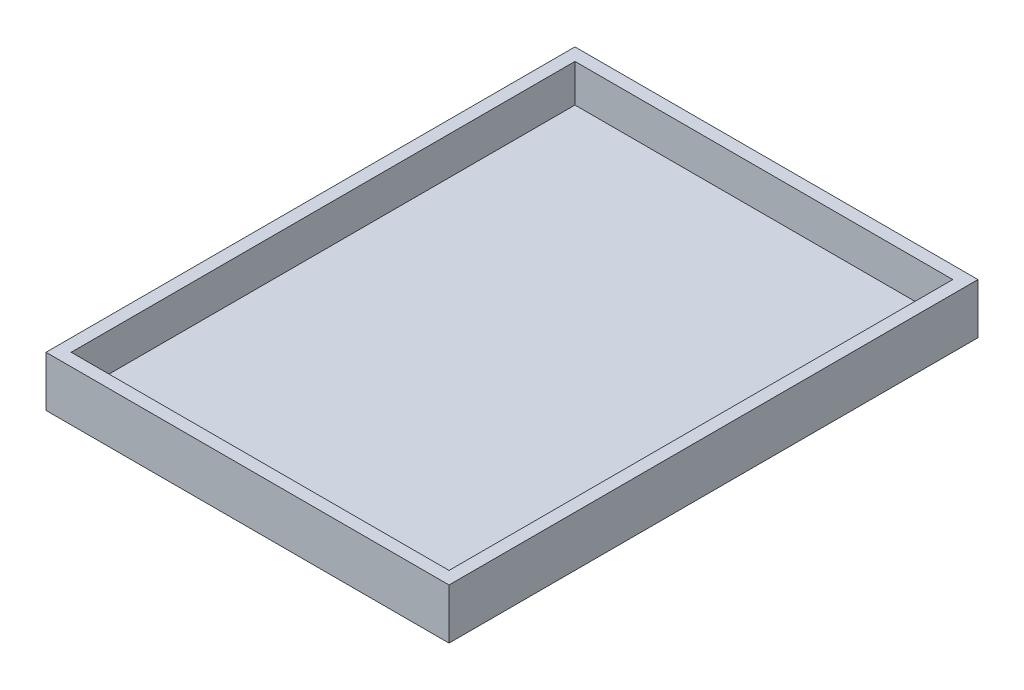
ISO-10303-21;
HEADER;
FILE_DESCRIPTION(('STEP AP214'),'2;1');
FILE_NAME('part.step','',(''),(''),'','','');
FILE_SCHEMA(('AUTOMOTIVE_DESIGN { 1 0 10303 214 1 1 1 1 }'));
ENDSEC;
DATA;
#1=APPLICATION_CONTEXT('core data for automotive mechanical design processes');
#2=APPLICATION_PROTOCOL_DEFINITION('international standard','automotive_design',2000,#1);
#3=PRODUCT_CONTEXT('',#1,'mechanical');
#4=PRODUCT('Part','Part','',(#3));
#5=PRODUCT_RELATED_PRODUCT_CATEGORY('part','',(#4));
#6=PRODUCT_DEFINITION_FORMATION('','',#4);
#7=PRODUCT_DEFINITION_CONTEXT('part definition',#1,'design');
#8=PRODUCT_DEFINITION('design','',#6,#7);
#9=PRODUCT_DEFINITION_SHAPE('','',#8);
#10=(LENGTH_UNIT() NAMED_UNIT(*) SI_UNIT(.MILLI.,.METRE.));
#11=(NAMED_UNIT(*) PLANE_ANGLE_UNIT() SI_UNIT($,.RADIAN.));
#12=(NAMED_UNIT(*) SI_UNIT($,.STERADIAN.) SOLID_ANGLE_UNIT());
#13=UNCERTAINTY_MEASURE_WITH_UNIT(LENGTH_MEASURE(1.E-05),#10,'distance_accuracy_value','');
#14=(GEOMETRIC_REPRESENTATION_CONTEXT(3) GLOBAL_UNCERTAINTY_ASSIGNED_CONTEXT((#13)) GLOBAL_UNIT_ASSIGNED_CONTEXT((#10,
#11,#12)) REPRESENTATION_CONTEXT('',''));
#15=CARTESIAN_POINT('',(0.,0.,0.));
#16=DIRECTION('',(0.,0.,1.));
#17=DIRECTION('',(1.,0.,0.));
#18=AXIS2_PLACEMENT_3D('',#15,#16,#17);
#19=CARTESIAN_POINT('',(0.,20.,0.));
#20=DIRECTION('',(0.,-1.,0.));
#21=DIRECTION('',(0.,0.,-1.));
#22=AXIS2_PLACEMENT_3D('',#19,#20,#21);
#23=PLANE('',#22);
#24=DIRECTION('',(0.,0.,-1.));
#25=VECTOR('',#24,1.);
#26=CARTESIAN_POINT('',(80.,20.,105.));
#27=LINE('',#26,#25);
#28=CARTESIAN_POINT('',(80.,20.,105.));
#29=VERTEX_POINT('',#28);
#30=CARTESIAN_POINT('',(80.,20.,-105.));
#31=VERTEX_POINT('',#30);
#32=EDGE_CURVE('E150',#29,#31,#27,.T.);
#33=ORIENTED_EDGE('',*,*,#32,.T.);
#34=DIRECTION('',(-1.,0.,0.));
#35=VECTOR('',#34,1.);
#36=CARTESIAN_POINT('',(-80.,20.,-105.));
#37=LINE('',#36,#35);
#38=CARTESIAN_POINT('',(-80.,20.,-105.));
#39=VERTEX_POINT('',#38);
#40=EDGE_CURVE('E91',#31,#39,#37,.T.);
#41=ORIENTED_EDGE('',*,*,#40,.T.);
#42=DIRECTION('',(0.,0.,1.));
#43=VECTOR('',#42,1.);
#44=CARTESIAN_POINT('',(-80.,20.,105.));
#45=LINE('',#44,#43);
#46=CARTESIAN_POINT('',(-80.,20.,105.));
#47=VERTEX_POINT('',#46);
#48=EDGE_CURVE('E148',#39,#47,#45,.T.);
#49=ORIENTED_EDGE('',*,*,#48,.T.);
#50=DIRECTION('',(1.,0.,0.));
#51=VECTOR('',#50,1.);
#52=CARTESIAN_POINT('',(-80.,20.,105.));
#53=LINE('',#52,#51);
#54=EDGE_CURVE('E61',#47,#29,#53,.T.);
#55=ORIENTED_EDGE('',*,*,#54,.T.);
#56=EDGE_LOOP('',(#33,#41,#49,#55));
#57=FACE_BOUND('',#56,.T.);
#58=DIRECTION('',(0.,0.,-1.));
#59=VECTOR('',#58,1.);
#60=CARTESIAN_POINT('',(75.,20.,0.));
#61=LINE('',#60,#59);
#62=CARTESIAN_POINT('',(75.,20.,100.));
#63=VERTEX_POINT('',#62);
#64=CARTESIAN_POINT('',(75.,20.,-100.));
#65=VERTEX_POINT('',#64);
#66=EDGE_CURVE('E136',#63,#65,#61,.T.);
#67=ORIENTED_EDGE('',*,*,#66,.F.);
#68=DIRECTION('',(1.,0.,0.));
#69=VECTOR('',#68,1.);
#70=CARTESIAN_POINT('',(0.,20.,100.));
#71=LINE('',#70,#69);
#72=CARTESIAN_POINT('',(-75.,20.,100.));
#73=VERTEX_POINT('',#72);
#74=EDGE_CURVE('E144',#73,#63,#71,.T.);
#75=ORIENTED_EDGE('',*,*,#74,.F.);
#76=DIRECTION('',(0.,0.,1.));
#77=VECTOR('',#76,1.);
#78=CARTESIAN_POINT('',(-75.,20.,0.));
#79=LINE('',#78,#77);
#80=CARTESIAN_POINT('',(-75.,20.,-100.));
#81=VERTEX_POINT('',#80);
#82=EDGE_CURVE('E142',#81,#73,#79,.T.);
#83=ORIENTED_EDGE('',*,*,#82,.F.);
#84=DIRECTION('',(-1.,0.,0.));
#85=VECTOR('',#84,1.);
#86=CARTESIAN_POINT('',(0.,20.,-100.));
#87=LINE('',#86,#85);
#88=EDGE_CURVE('E126',#65,#81,#87,.T.);
#89=ORIENTED_EDGE('',*,*,#88,.F.);
#90=EDGE_LOOP('',(#67,#75,#83,#89));
#91=FACE_BOUND('',#90,.T.);
#92=ADVANCED_FACE('F39',(#57,#91),#23,.F.);
#93=CARTESIAN_POINT('',(80.,20.,105.));
#94=DIRECTION('',(-1.,0.,0.));
#95=DIRECTION('',(0.,0.,1.));
#96=AXIS2_PLACEMENT_3D('',#93,#94,#95);
#97=PLANE('',#96);
#98=DIRECTION('',(0.,0.,-1.));
#99=VECTOR('',#98,1.);
#100=CARTESIAN_POINT('',(80.,0.,105.));
#101=LINE('',#100,#99);
#102=CARTESIAN_POINT('',(80.,0.,105.));
#103=VERTEX_POINT('',#102);
#104=CARTESIAN_POINT('',(80.,0.,-105.));
#105=VERTEX_POINT('',#104);
#106=EDGE_CURVE('E152',#103,#105,#101,.T.);
#107=ORIENTED_EDGE('',*,*,#106,.T.);
#108=DIRECTION('',(0.,-1.,0.));
#109=VECTOR('',#108,1.);
#110=CARTESIAN_POINT('',(80.,20.,-105.));
#111=LINE('',#110,#109);
#112=EDGE_CURVE('E11',#31,#105,#111,.T.);
#113=ORIENTED_EDGE('',*,*,#112,.F.);
#114=ORIENTED_EDGE('',*,*,#32,.F.);
#115=DIRECTION('',(0.,-1.,0.));
#116=VECTOR('',#115,1.);
#117=CARTESIAN_POINT('',(80.,20.,105.));
#118=LINE('',#117,#116);
#119=EDGE_CURVE('E151',#29,#103,#118,.T.);
#120=ORIENTED_EDGE('',*,*,#119,.T.);
#121=EDGE_LOOP('',(#107,#113,#114,#120));
#122=FACE_BOUND('',#121,.T.);
#123=ADVANCED_FACE('F41',(#122),#97,.F.);
#124=CARTESIAN_POINT('',(-80.,20.,-105.));
#125=DIRECTION('',(0.,0.,1.));
#126=DIRECTION('',(1.,0.,0.));
#127=AXIS2_PLACEMENT_3D('',#124,#125,#126);
#128=PLANE('',#127);
#129=DIRECTION('',(-1.,0.,0.));
#130=VECTOR('',#129,1.);
#131=CARTESIAN_POINT('',(-80.,0.,-105.));
#132=LINE('',#131,#130);
#133=CARTESIAN_POINT('',(-80.,0.,-105.));
#134=VERTEX_POINT('',#133);
#135=EDGE_CURVE('E160',#105,#134,#132,.T.);
#136=ORIENTED_EDGE('',*,*,#135,.T.);
#137=DIRECTION('',(0.,-1.,0.));
#138=VECTOR('',#137,1.);
#139=CARTESIAN_POINT('',(-80.,20.,-105.));
#140=LINE('',#139,#138);
#141=EDGE_CURVE('E50',#39,#134,#140,.T.);
#142=ORIENTED_EDGE('',*,*,#141,.F.);
#143=ORIENTED_EDGE('',*,*,#40,.F.);
#144=ORIENTED_EDGE('',*,*,#112,.T.);
#145=EDGE_LOOP('',(#136,#142,#143,#144));
#146=FACE_BOUND('',#145,.T.);
#147=ADVANCED_FACE('F184',(#146),#128,.F.);
#148=CARTESIAN_POINT('',(-80.,20.,105.));
#149=DIRECTION('',(1.,0.,0.));
#150=DIRECTION('',(0.,0.,-1.));
#151=AXIS2_PLACEMENT_3D('',#148,#149,#150);
#152=PLANE('',#151);
#153=DIRECTION('',(0.,0.,1.));
#154=VECTOR('',#153,1.);
#155=CARTESIAN_POINT('',(-80.,0.,105.));
#156=LINE('',#155,#154);
#157=CARTESIAN_POINT('',(-80.,0.,105.));
#158=VERTEX_POINT('',#157);
#159=EDGE_CURVE('E159',#134,#158,#156,.T.);
#160=ORIENTED_EDGE('',*,*,#159,.T.);
#161=DIRECTION('',(0.,-1.,0.));
#162=VECTOR('',#161,1.);
#163=CARTESIAN_POINT('',(-80.,20.,105.));
#164=LINE('',#163,#162);
#165=EDGE_CURVE('E161',#47,#158,#164,.T.);
#166=ORIENTED_EDGE('',*,*,#165,.F.);
#167=ORIENTED_EDGE('',*,*,#48,.F.);
#168=ORIENTED_EDGE('',*,*,#141,.T.);
#169=EDGE_LOOP('',(#160,#166,#167,#168));
#170=FACE_BOUND('',#169,.T.);
#171=ADVANCED_FACE('F166',(#170),#152,.F.);
#172=CARTESIAN_POINT('',(-80.,20.,105.));
#173=DIRECTION('',(0.,0.,-1.));
#174=DIRECTION('',(-1.,0.,0.));
#175=AXIS2_PLACEMENT_3D('',#172,#173,#174);
#176=PLANE('',#175);
#177=DIRECTION('',(1.,0.,0.));
#178=VECTOR('',#177,1.);
#179=CARTESIAN_POINT('',(-80.,0.,105.));
#180=LINE('',#179,#178);
#181=EDGE_CURVE('E84',#158,#103,#180,.T.);
#182=ORIENTED_EDGE('',*,*,#181,.T.);
#183=ORIENTED_EDGE('',*,*,#119,.F.);
#184=ORIENTED_EDGE('',*,*,#54,.F.);
#185=ORIENTED_EDGE('',*,*,#165,.T.);
#186=EDGE_LOOP('',(#182,#183,#184,#185));
#187=FACE_BOUND('',#186,.T.);
#188=ADVANCED_FACE('F176',(#187),#176,.F.);
#189=CARTESIAN_POINT('',(0.,0.,0.));
#190=DIRECTION('',(0.,-1.,0.));
#191=DIRECTION('',(0.,0.,-1.));
#192=AXIS2_PLACEMENT_3D('',#189,#190,#191);
#193=PLANE('',#192);
#194=ORIENTED_EDGE('',*,*,#106,.F.);
#195=ORIENTED_EDGE('',*,*,#181,.F.);
#196=ORIENTED_EDGE('',*,*,#159,.F.);
#197=ORIENTED_EDGE('',*,*,#135,.F.);
#198=EDGE_LOOP('',(#194,#195,#196,#197));
#199=FACE_BOUND('',#198,.T.);
#200=ADVANCED_FACE('F175',(#199),#193,.T.);
#201=CARTESIAN_POINT('',(75.,20.,105.));
#202=DIRECTION('',(-1.,0.,0.));
#203=DIRECTION('',(0.,0.,1.));
#204=AXIS2_PLACEMENT_3D('',#201,#202,#203);
#205=PLANE('',#204);
#206=DIRECTION('',(0.,0.,-1.));
#207=VECTOR('',#206,1.);
#208=CARTESIAN_POINT('',(75.,5.,0.));
#209=LINE('',#208,#207);
#210=CARTESIAN_POINT('',(75.,5.,100.));
#211=VERTEX_POINT('',#210);
#212=CARTESIAN_POINT('',(75.,5.,-100.));
#213=VERTEX_POINT('',#212);
#214=EDGE_CURVE('E117',#211,#213,#209,.T.);
#215=ORIENTED_EDGE('',*,*,#214,.F.);
#216=DIRECTION('',(0.,-1.,0.));
#217=VECTOR('',#216,1.);
#218=CARTESIAN_POINT('',(75.,20.,100.));
#219=LINE('',#218,#217);
#220=EDGE_CURVE('E137',#63,#211,#219,.T.);
#221=ORIENTED_EDGE('',*,*,#220,.F.);
#222=ORIENTED_EDGE('',*,*,#66,.T.);
#223=DIRECTION('',(0.,-1.,0.));
#224=VECTOR('',#223,1.);
#225=CARTESIAN_POINT('',(75.,20.,-100.));
#226=LINE('',#225,#224);
#227=EDGE_CURVE('E131',#65,#213,#226,.T.);
#228=ORIENTED_EDGE('',*,*,#227,.T.);
#229=EDGE_LOOP('',(#215,#221,#222,#228));
#230=FACE_BOUND('',#229,.T.);
#231=ADVANCED_FACE('F183',(#230),#205,.T.);
#232=CARTESIAN_POINT('',(-80.,20.,-100.));
#233=DIRECTION('',(0.,0.,1.));
#234=DIRECTION('',(1.,0.,0.));
#235=AXIS2_PLACEMENT_3D('',#232,#233,#234);
#236=PLANE('',#235);
#237=DIRECTION('',(-1.,0.,0.));
#238=VECTOR('',#237,1.);
#239=CARTESIAN_POINT('',(0.,5.,-100.));
#240=LINE('',#239,#238);
#241=CARTESIAN_POINT('',(-75.,5.,-100.));
#242=VERTEX_POINT('',#241);
#243=EDGE_CURVE('E111',#213,#242,#240,.T.);
#244=ORIENTED_EDGE('',*,*,#243,.F.);
#245=ORIENTED_EDGE('',*,*,#227,.F.);
#246=ORIENTED_EDGE('',*,*,#88,.T.);
#247=DIRECTION('',(0.,-1.,0.));
#248=VECTOR('',#247,1.);
#249=CARTESIAN_POINT('',(-75.,20.,-100.));
#250=LINE('',#249,#248);
#251=EDGE_CURVE('E124',#81,#242,#250,.T.);
#252=ORIENTED_EDGE('',*,*,#251,.T.);
#253=EDGE_LOOP('',(#244,#245,#246,#252));
#254=FACE_BOUND('',#253,.T.);
#255=ADVANCED_FACE('F128',(#254),#236,.T.);
#256=CARTESIAN_POINT('',(-75.,20.,105.));
#257=DIRECTION('',(1.,0.,0.));
#258=DIRECTION('',(0.,0.,-1.));
#259=AXIS2_PLACEMENT_3D('',#256,#257,#258);
#260=PLANE('',#259);
#261=DIRECTION('',(0.,0.,1.));
#262=VECTOR('',#261,1.);
#263=CARTESIAN_POINT('',(-75.,5.,0.));
#264=LINE('',#263,#262);
#265=CARTESIAN_POINT('',(-75.,5.,100.));
#266=VERTEX_POINT('',#265);
#267=EDGE_CURVE('E120',#242,#266,#264,.T.);
#268=ORIENTED_EDGE('',*,*,#267,.F.);
#269=ORIENTED_EDGE('',*,*,#251,.F.);
#270=ORIENTED_EDGE('',*,*,#82,.T.);
#271=DIRECTION('',(0.,-1.,0.));
#272=VECTOR('',#271,1.);
#273=CARTESIAN_POINT('',(-75.,20.,100.));
#274=LINE('',#273,#272);
#275=EDGE_CURVE('E53',#73,#266,#274,.T.);
#276=ORIENTED_EDGE('',*,*,#275,.T.);
#277=EDGE_LOOP('',(#268,#269,#270,#276));
#278=FACE_BOUND('',#277,.T.);
#279=ADVANCED_FACE('F133',(#278),#260,.T.);
#280=CARTESIAN_POINT('',(-80.,20.,100.));
#281=DIRECTION('',(0.,0.,-1.));
#282=DIRECTION('',(-1.,0.,0.));
#283=AXIS2_PLACEMENT_3D('',#280,#281,#282);
#284=PLANE('',#283);
#285=DIRECTION('',(1.,0.,0.));
#286=VECTOR('',#285,1.);
#287=CARTESIAN_POINT('',(0.,5.,100.));
#288=LINE('',#287,#286);
#289=EDGE_CURVE('E132',#266,#211,#288,.T.);
#290=ORIENTED_EDGE('',*,*,#289,.F.);
#291=ORIENTED_EDGE('',*,*,#275,.F.);
#292=ORIENTED_EDGE('',*,*,#74,.T.);
#293=ORIENTED_EDGE('',*,*,#220,.T.);
#294=EDGE_LOOP('',(#290,#291,#292,#293));
#295=FACE_BOUND('',#294,.T.);
#296=ADVANCED_FACE('F200',(#295),#284,.T.);
#297=CARTESIAN_POINT('',(0.,5.,0.));
#298=DIRECTION('',(0.,-1.,0.));
#299=DIRECTION('',(0.,0.,-1.));
#300=AXIS2_PLACEMENT_3D('',#297,#298,#299);
#301=PLANE('',#300);
#302=ORIENTED_EDGE('',*,*,#214,.T.);
#303=ORIENTED_EDGE('',*,*,#243,.T.);
#304=ORIENTED_EDGE('',*,*,#267,.T.);
#305=ORIENTED_EDGE('',*,*,#289,.T.);
#306=EDGE_LOOP('',(#302,#303,#304,#305));
#307=FACE_BOUND('',#306,.T.);
#308=ADVANCED_FACE('F113',(#307),#301,.F.);
#309=CLOSED_SHELL('',(#92,#123,#147,#171,#188,#200,#231,#255,#279,#296,#308));
#310=MANIFOLD_SOLID_BREP('B2',#309);
#311=ADVANCED_BREP_SHAPE_REPRESENTATION('',(#18,#310),#14);
#312=SHAPE_DEFINITION_REPRESENTATION(#9,#311);
ENDSEC;
END-ISO-10303-21;
